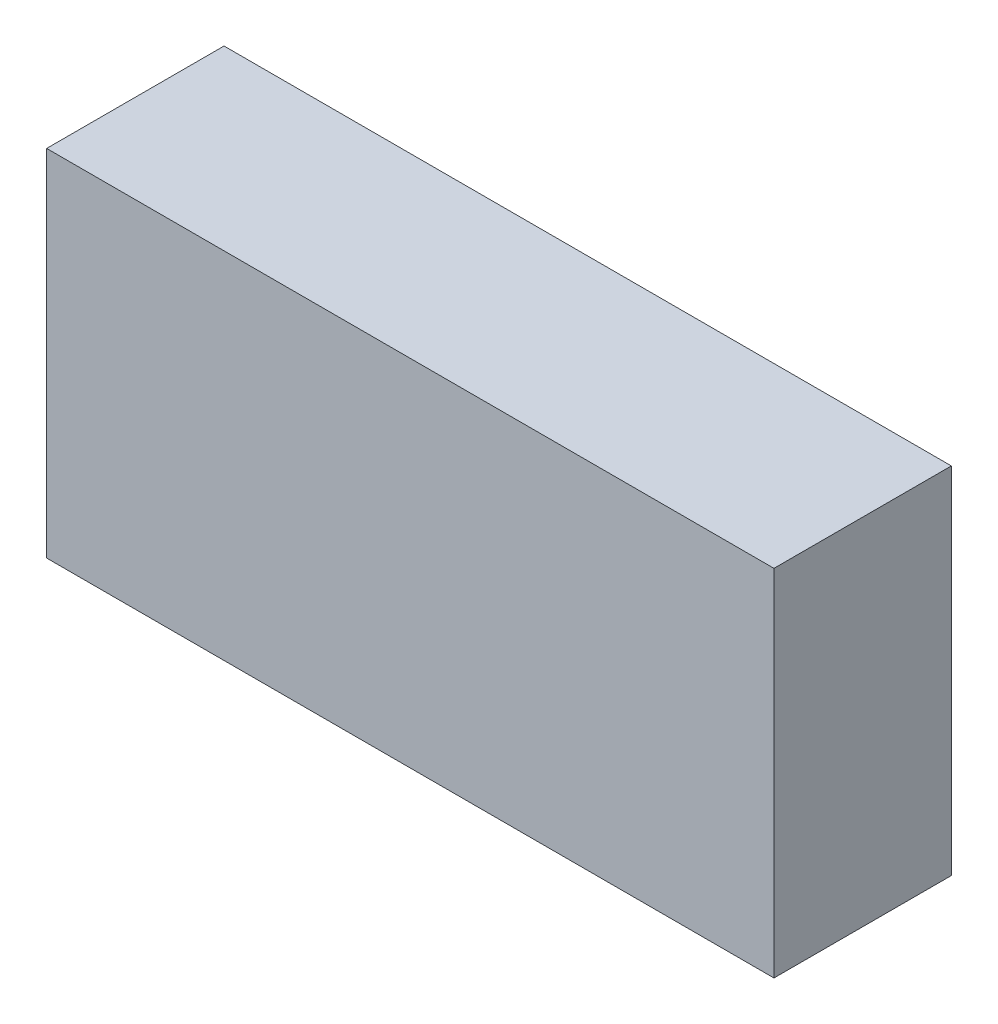
ISO-10303-21;
HEADER;
FILE_DESCRIPTION(('STEP AP214'),'2;1');
FILE_NAME('part.step','',(''),(''),'','','');
FILE_SCHEMA(('AUTOMOTIVE_DESIGN { 1 0 10303 214 1 1 1 1 }'));
ENDSEC;
DATA;
#1=APPLICATION_CONTEXT('core data for automotive mechanical design processes');
#2=APPLICATION_PROTOCOL_DEFINITION('international standard','automotive_design',2000,#1);
#3=PRODUCT_CONTEXT('',#1,'mechanical');
#4=PRODUCT('Part','Part','',(#3));
#5=PRODUCT_RELATED_PRODUCT_CATEGORY('part','',(#4));
#6=PRODUCT_DEFINITION_FORMATION('','',#4);
#7=PRODUCT_DEFINITION_CONTEXT('part definition',#1,'design');
#8=PRODUCT_DEFINITION('design','',#6,#7);
#9=PRODUCT_DEFINITION_SHAPE('','',#8);
#10=(LENGTH_UNIT() NAMED_UNIT(*) SI_UNIT(.MILLI.,.METRE.));
#11=(NAMED_UNIT(*) PLANE_ANGLE_UNIT() SI_UNIT($,.RADIAN.));
#12=(NAMED_UNIT(*) SI_UNIT($,.STERADIAN.) SOLID_ANGLE_UNIT());
#13=UNCERTAINTY_MEASURE_WITH_UNIT(LENGTH_MEASURE(1.E-05),#10,'distance_accuracy_value','');
#14=(GEOMETRIC_REPRESENTATION_CONTEXT(3) GLOBAL_UNCERTAINTY_ASSIGNED_CONTEXT((#13)) GLOBAL_UNIT_ASSIGNED_CONTEXT((#10,
#11,#12)) REPRESENTATION_CONTEXT('',''));
#15=CARTESIAN_POINT('',(0.,0.,0.));
#16=DIRECTION('',(0.,0.,1.));
#17=DIRECTION('',(1.,0.,0.));
#18=AXIS2_PLACEMENT_3D('',#15,#16,#17);
#19=CARTESIAN_POINT('',(0.,0.,10.));
#20=DIRECTION('',(1.,0.,0.));
#21=DIRECTION('',(0.,0.,-1.));
#22=AXIS2_PLACEMENT_3D('',#19,#20,#21);
#23=PLANE('',#22);
#24=DIRECTION('',(0.,-1.,0.));
#25=VECTOR('',#24,1.);
#26=CARTESIAN_POINT('',(0.,0.,0.));
#27=LINE('',#26,#25);
#28=CARTESIAN_POINT('',(0.,20.,0.));
#29=VERTEX_POINT('',#28);
#30=CARTESIAN_POINT('',(0.,0.,0.));
#31=VERTEX_POINT('',#30);
#32=EDGE_CURVE('E106',#29,#31,#27,.T.);
#33=ORIENTED_EDGE('',*,*,#32,.T.);
#34=DIRECTION('',(0.,0.,-1.));
#35=VECTOR('',#34,1.);
#36=CARTESIAN_POINT('',(0.,0.,10.));
#37=LINE('',#36,#35);
#38=CARTESIAN_POINT('',(0.,0.,10.));
#39=VERTEX_POINT('',#38);
#40=EDGE_CURVE('E11',#39,#31,#37,.T.);
#41=ORIENTED_EDGE('',*,*,#40,.F.);
#42=DIRECTION('',(0.,-1.,0.));
#43=VECTOR('',#42,1.);
#44=CARTESIAN_POINT('',(0.,0.,10.));
#45=LINE('',#44,#43);
#46=CARTESIAN_POINT('',(0.,20.,10.));
#47=VERTEX_POINT('',#46);
#48=EDGE_CURVE('E94',#47,#39,#45,.T.);
#49=ORIENTED_EDGE('',*,*,#48,.F.);
#50=DIRECTION('',(0.,0.,-1.));
#51=VECTOR('',#50,1.);
#52=CARTESIAN_POINT('',(0.,20.,10.));
#53=LINE('',#52,#51);
#54=EDGE_CURVE('E105',#47,#29,#53,.T.);
#55=ORIENTED_EDGE('',*,*,#54,.T.);
#56=EDGE_LOOP('',(#33,#41,#49,#55));
#57=FACE_BOUND('',#56,.T.);
#58=ADVANCED_FACE('F43',(#57),#23,.F.);
#59=CARTESIAN_POINT('',(0.,0.,10.));
#60=DIRECTION('',(0.,1.,0.));
#61=DIRECTION('',(0.,0.,1.));
#62=AXIS2_PLACEMENT_3D('',#59,#60,#61);
#63=PLANE('',#62);
#64=DIRECTION('',(1.,0.,0.));
#65=VECTOR('',#64,1.);
#66=CARTESIAN_POINT('',(0.,0.,0.));
#67=LINE('',#66,#65);
#68=CARTESIAN_POINT('',(41.,0.,0.));
#69=VERTEX_POINT('',#68);
#70=EDGE_CURVE('E98',#31,#69,#67,.T.);
#71=ORIENTED_EDGE('',*,*,#70,.T.);
#72=DIRECTION('',(0.,0.,-1.));
#73=VECTOR('',#72,1.);
#74=CARTESIAN_POINT('',(41.,0.,10.));
#75=LINE('',#74,#73);
#76=CARTESIAN_POINT('',(41.,0.,10.));
#77=VERTEX_POINT('',#76);
#78=EDGE_CURVE('E51',#77,#69,#75,.T.);
#79=ORIENTED_EDGE('',*,*,#78,.F.);
#80=DIRECTION('',(1.,0.,0.));
#81=VECTOR('',#80,1.);
#82=CARTESIAN_POINT('',(0.,0.,10.));
#83=LINE('',#82,#81);
#84=EDGE_CURVE('E90',#39,#77,#83,.T.);
#85=ORIENTED_EDGE('',*,*,#84,.F.);
#86=ORIENTED_EDGE('',*,*,#40,.T.);
#87=EDGE_LOOP('',(#71,#79,#85,#86));
#88=FACE_BOUND('',#87,.T.);
#89=ADVANCED_FACE('F100',(#88),#63,.F.);
#90=CARTESIAN_POINT('',(41.,0.,10.));
#91=DIRECTION('',(-1.,0.,0.));
#92=DIRECTION('',(0.,0.,1.));
#93=AXIS2_PLACEMENT_3D('',#90,#91,#92);
#94=PLANE('',#93);
#95=DIRECTION('',(0.,1.,0.));
#96=VECTOR('',#95,1.);
#97=CARTESIAN_POINT('',(41.,0.,0.));
#98=LINE('',#97,#96);
#99=CARTESIAN_POINT('',(41.,20.,0.));
#100=VERTEX_POINT('',#99);
#101=EDGE_CURVE('E77',#69,#100,#98,.T.);
#102=ORIENTED_EDGE('',*,*,#101,.T.);
#103=DIRECTION('',(0.,0.,-1.));
#104=VECTOR('',#103,1.);
#105=CARTESIAN_POINT('',(41.,20.,10.));
#106=LINE('',#105,#104);
#107=CARTESIAN_POINT('',(41.,20.,10.));
#108=VERTEX_POINT('',#107);
#109=EDGE_CURVE('E97',#108,#100,#106,.T.);
#110=ORIENTED_EDGE('',*,*,#109,.F.);
#111=DIRECTION('',(0.,1.,0.));
#112=VECTOR('',#111,1.);
#113=CARTESIAN_POINT('',(41.,0.,10.));
#114=LINE('',#113,#112);
#115=EDGE_CURVE('E95',#77,#108,#114,.T.);
#116=ORIENTED_EDGE('',*,*,#115,.F.);
#117=ORIENTED_EDGE('',*,*,#78,.T.);
#118=EDGE_LOOP('',(#102,#110,#116,#117));
#119=FACE_BOUND('',#118,.T.);
#120=ADVANCED_FACE('F99',(#119),#94,.F.);
#121=CARTESIAN_POINT('',(0.,20.,10.));
#122=DIRECTION('',(0.,-1.,0.));
#123=DIRECTION('',(0.,0.,-1.));
#124=AXIS2_PLACEMENT_3D('',#121,#122,#123);
#125=PLANE('',#124);
#126=DIRECTION('',(-1.,0.,0.));
#127=VECTOR('',#126,1.);
#128=CARTESIAN_POINT('',(0.,20.,0.));
#129=LINE('',#128,#127);
#130=EDGE_CURVE('E85',#100,#29,#129,.T.);
#131=ORIENTED_EDGE('',*,*,#130,.T.);
#132=ORIENTED_EDGE('',*,*,#54,.F.);
#133=DIRECTION('',(-1.,0.,0.));
#134=VECTOR('',#133,1.);
#135=CARTESIAN_POINT('',(0.,20.,10.));
#136=LINE('',#135,#134);
#137=EDGE_CURVE('E56',#108,#47,#136,.T.);
#138=ORIENTED_EDGE('',*,*,#137,.F.);
#139=ORIENTED_EDGE('',*,*,#109,.T.);
#140=EDGE_LOOP('',(#131,#132,#138,#139));
#141=FACE_BOUND('',#140,.T.);
#142=ADVANCED_FACE('F114',(#141),#125,.F.);
#143=CARTESIAN_POINT('',(0.,0.,10.));
#144=DIRECTION('',(0.,0.,-1.));
#145=DIRECTION('',(-1.,0.,0.));
#146=AXIS2_PLACEMENT_3D('',#143,#144,#145);
#147=PLANE('',#146);
#148=ORIENTED_EDGE('',*,*,#48,.T.);
#149=ORIENTED_EDGE('',*,*,#84,.T.);
#150=ORIENTED_EDGE('',*,*,#115,.T.);
#151=ORIENTED_EDGE('',*,*,#137,.T.);
#152=EDGE_LOOP('',(#148,#149,#150,#151));
#153=FACE_BOUND('',#152,.T.);
#154=ADVANCED_FACE('F89',(#153),#147,.F.);
#155=CARTESIAN_POINT('',(0.,0.,0.));
#156=DIRECTION('',(0.,0.,-1.));
#157=DIRECTION('',(-1.,0.,0.));
#158=AXIS2_PLACEMENT_3D('',#155,#156,#157);
#159=PLANE('',#158);
#160=ORIENTED_EDGE('',*,*,#32,.F.);
#161=ORIENTED_EDGE('',*,*,#130,.F.);
#162=ORIENTED_EDGE('',*,*,#101,.F.);
#163=ORIENTED_EDGE('',*,*,#70,.F.);
#164=EDGE_LOOP('',(#160,#161,#162,#163));
#165=FACE_BOUND('',#164,.T.);
#166=ADVANCED_FACE('F117',(#165),#159,.T.);
#167=CLOSED_SHELL('',(#58,#89,#120,#142,#154,#166));
#168=MANIFOLD_SOLID_BREP('B2',#167);
#169=ADVANCED_BREP_SHAPE_REPRESENTATION('',(#18,#168),#14);
#170=SHAPE_DEFINITION_REPRESENTATION(#9,#169);
ENDSEC;
END-ISO-10303-21;
